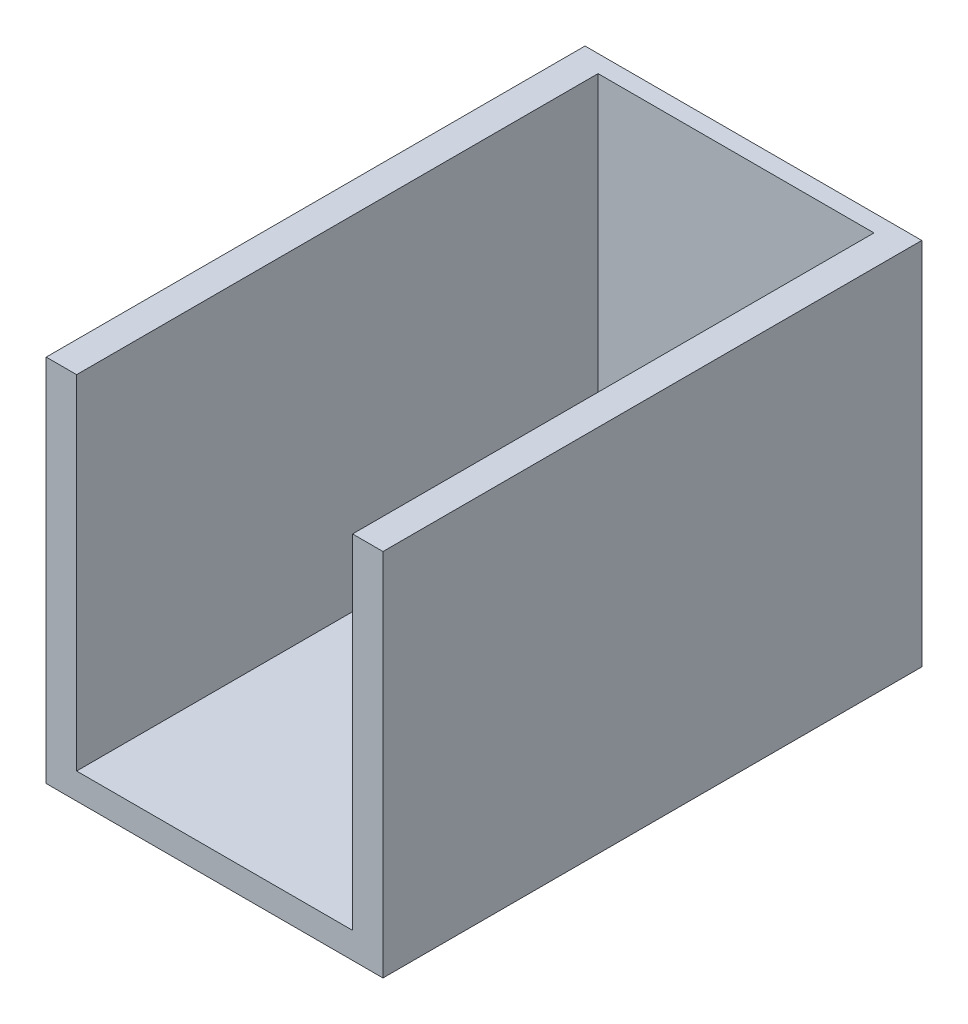
ISO-10303-21;
HEADER;
FILE_DESCRIPTION(('STEP AP214'),'2;1');
FILE_NAME('part.step','',(''),(''),'','','');
FILE_SCHEMA(('AUTOMOTIVE_DESIGN { 1 0 10303 214 1 1 1 1 }'));
ENDSEC;
DATA;
#1=APPLICATION_CONTEXT('core data for automotive mechanical design processes');
#2=APPLICATION_PROTOCOL_DEFINITION('international standard','automotive_design',2000,#1);
#3=PRODUCT_CONTEXT('',#1,'mechanical');
#4=PRODUCT('Part','Part','',(#3));
#5=PRODUCT_RELATED_PRODUCT_CATEGORY('part','',(#4));
#6=PRODUCT_DEFINITION_FORMATION('','',#4);
#7=PRODUCT_DEFINITION_CONTEXT('part definition',#1,'design');
#8=PRODUCT_DEFINITION('design','',#6,#7);
#9=PRODUCT_DEFINITION_SHAPE('','',#8);
#10=(LENGTH_UNIT() NAMED_UNIT(*) SI_UNIT(.MILLI.,.METRE.));
#11=(NAMED_UNIT(*) PLANE_ANGLE_UNIT() SI_UNIT($,.RADIAN.));
#12=(NAMED_UNIT(*) SI_UNIT($,.STERADIAN.) SOLID_ANGLE_UNIT());
#13=UNCERTAINTY_MEASURE_WITH_UNIT(LENGTH_MEASURE(1.E-05),#10,'distance_accuracy_value','');
#14=(GEOMETRIC_REPRESENTATION_CONTEXT(3) GLOBAL_UNCERTAINTY_ASSIGNED_CONTEXT((#13)) GLOBAL_UNIT_ASSIGNED_CONTEXT((#10,
#11,#12)) REPRESENTATION_CONTEXT('',''));
#15=CARTESIAN_POINT('',(0.,0.,0.));
#16=DIRECTION('',(0.,0.,1.));
#17=DIRECTION('',(1.,0.,0.));
#18=AXIS2_PLACEMENT_3D('',#15,#16,#17);
#19=CARTESIAN_POINT('',(31.75,79.,60.));
#20=DIRECTION('',(1.,0.,0.));
#21=DIRECTION('',(0.,1.,0.));
#22=AXIS2_PLACEMENT_3D('',#19,#20,#21);
#23=PLANE('',#22);
#24=DIRECTION('',(0.,-1.,0.));
#25=VECTOR('',#24,1.);
#26=CARTESIAN_POINT('',(31.75,79.,-60.));
#27=LINE('',#26,#25);
#28=CARTESIAN_POINT('',(31.75,79.,-60.));
#29=VERTEX_POINT('',#28);
#30=CARTESIAN_POINT('',(31.75,0.,-60.));
#31=VERTEX_POINT('',#30);
#32=EDGE_CURVE('E143',#29,#31,#27,.T.);
#33=ORIENTED_EDGE('',*,*,#32,.T.);
#34=DIRECTION('',(0.,0.,-1.));
#35=VECTOR('',#34,1.);
#36=CARTESIAN_POINT('',(31.75,0.,60.));
#37=LINE('',#36,#35);
#38=CARTESIAN_POINT('',(31.75,0.,60.));
#39=VERTEX_POINT('',#38);
#40=EDGE_CURVE('E56',#39,#31,#37,.T.);
#41=ORIENTED_EDGE('',*,*,#40,.F.);
#42=DIRECTION('',(0.,-1.,0.));
#43=VECTOR('',#42,1.);
#44=CARTESIAN_POINT('',(31.75,79.,60.));
#45=LINE('',#44,#43);
#46=CARTESIAN_POINT('',(31.75,79.,60.));
#47=VERTEX_POINT('',#46);
#48=EDGE_CURVE('E148',#47,#39,#45,.T.);
#49=ORIENTED_EDGE('',*,*,#48,.F.);
#50=DIRECTION('',(0.,0.,-1.));
#51=VECTOR('',#50,1.);
#52=CARTESIAN_POINT('',(31.75,79.,60.));
#53=LINE('',#52,#51);
#54=EDGE_CURVE('E11',#47,#29,#53,.T.);
#55=ORIENTED_EDGE('',*,*,#54,.T.);
#56=EDGE_LOOP('',(#33,#41,#49,#55));
#57=FACE_BOUND('',#56,.T.);
#58=ADVANCED_FACE('F47',(#57),#23,.F.);
#59=CARTESIAN_POINT('',(-31.75,0.,60.));
#60=DIRECTION('',(0.,-1.,0.));
#61=DIRECTION('',(1.,0.,0.));
#62=AXIS2_PLACEMENT_3D('',#59,#60,#61);
#63=PLANE('',#62);
#64=DIRECTION('',(-1.,0.,0.));
#65=VECTOR('',#64,1.);
#66=CARTESIAN_POINT('',(-31.75,0.,-60.));
#67=LINE('',#66,#65);
#68=CARTESIAN_POINT('',(-31.75,0.,-60.));
#69=VERTEX_POINT('',#68);
#70=EDGE_CURVE('E172',#31,#69,#67,.T.);
#71=ORIENTED_EDGE('',*,*,#70,.T.);
#72=DIRECTION('',(0.,0.,-1.));
#73=VECTOR('',#72,1.);
#74=CARTESIAN_POINT('',(-31.75,0.,60.));
#75=LINE('',#74,#73);
#76=CARTESIAN_POINT('',(-31.75,0.,60.));
#77=VERTEX_POINT('',#76);
#78=EDGE_CURVE('E190',#77,#69,#75,.T.);
#79=ORIENTED_EDGE('',*,*,#78,.F.);
#80=DIRECTION('',(-1.,0.,0.));
#81=VECTOR('',#80,1.);
#82=CARTESIAN_POINT('',(-31.75,0.,60.));
#83=LINE('',#82,#81);
#84=EDGE_CURVE('E152',#39,#77,#83,.T.);
#85=ORIENTED_EDGE('',*,*,#84,.F.);
#86=ORIENTED_EDGE('',*,*,#40,.T.);
#87=EDGE_LOOP('',(#71,#79,#85,#86));
#88=FACE_BOUND('',#87,.T.);
#89=ADVANCED_FACE('F198',(#88),#63,.F.);
#90=CARTESIAN_POINT('',(-31.75,0.,60.));
#91=DIRECTION('',(-1.,0.,0.));
#92=DIRECTION('',(0.,-1.,0.));
#93=AXIS2_PLACEMENT_3D('',#90,#91,#92);
#94=PLANE('',#93);
#95=DIRECTION('',(0.,1.,0.));
#96=VECTOR('',#95,1.);
#97=CARTESIAN_POINT('',(-31.75,0.,-60.));
#98=LINE('',#97,#96);
#99=CARTESIAN_POINT('',(-31.75,79.,-60.));
#100=VERTEX_POINT('',#99);
#101=EDGE_CURVE('E149',#69,#100,#98,.T.);
#102=ORIENTED_EDGE('',*,*,#101,.T.);
#103=DIRECTION('',(0.,0.,-1.));
#104=VECTOR('',#103,1.);
#105=CARTESIAN_POINT('',(-31.75,79.,60.));
#106=LINE('',#105,#104);
#107=CARTESIAN_POINT('',(-31.75,79.,60.));
#108=VERTEX_POINT('',#107);
#109=EDGE_CURVE('E186',#108,#100,#106,.T.);
#110=ORIENTED_EDGE('',*,*,#109,.F.);
#111=DIRECTION('',(0.,1.,0.));
#112=VECTOR('',#111,1.);
#113=CARTESIAN_POINT('',(-31.75,0.,60.));
#114=LINE('',#113,#112);
#115=EDGE_CURVE('E155',#77,#108,#114,.T.);
#116=ORIENTED_EDGE('',*,*,#115,.F.);
#117=ORIENTED_EDGE('',*,*,#78,.T.);
#118=EDGE_LOOP('',(#102,#110,#116,#117));
#119=FACE_BOUND('',#118,.T.);
#120=ADVANCED_FACE('F213',(#119),#94,.F.);
#121=CARTESIAN_POINT('',(-31.75,79.,60.));
#122=DIRECTION('',(0.,-1.,0.));
#123=DIRECTION('',(0.,0.,-1.));
#124=AXIS2_PLACEMENT_3D('',#121,#122,#123);
#125=PLANE('',#124);
#126=ORIENTED_EDGE('',*,*,#109,.T.);
#127=DIRECTION('',(1.,0.,0.));
#128=VECTOR('',#127,1.);
#129=CARTESIAN_POINT('',(38.75,79.,-60.));
#130=LINE('',#129,#128);
#131=EDGE_CURVE('E134',#100,#29,#130,.T.);
#132=ORIENTED_EDGE('',*,*,#131,.T.);
#133=ORIENTED_EDGE('',*,*,#54,.F.);
#134=DIRECTION('',(-1.,0.,0.));
#135=VECTOR('',#134,1.);
#136=CARTESIAN_POINT('',(38.75,79.,60.));
#137=LINE('',#136,#135);
#138=CARTESIAN_POINT('',(38.75,79.,60.));
#139=VERTEX_POINT('',#138);
#140=EDGE_CURVE('E145',#139,#47,#137,.T.);
#141=ORIENTED_EDGE('',*,*,#140,.F.);
#142=DIRECTION('',(0.,0.,-1.));
#143=VECTOR('',#142,1.);
#144=CARTESIAN_POINT('',(38.75,79.,60.));
#145=LINE('',#144,#143);
#146=CARTESIAN_POINT('',(38.75,79.,-64.));
#147=VERTEX_POINT('',#146);
#148=EDGE_CURVE('E117',#139,#147,#145,.T.);
#149=ORIENTED_EDGE('',*,*,#148,.T.);
#150=DIRECTION('',(1.,0.,0.));
#151=VECTOR('',#150,1.);
#152=CARTESIAN_POINT('',(38.75,79.,-64.));
#153=LINE('',#152,#151);
#154=CARTESIAN_POINT('',(-38.75,79.,-64.));
#155=VERTEX_POINT('',#154);
#156=EDGE_CURVE('E132',#155,#147,#153,.T.);
#157=ORIENTED_EDGE('',*,*,#156,.F.);
#158=DIRECTION('',(0.,0.,-1.));
#159=VECTOR('',#158,1.);
#160=CARTESIAN_POINT('',(-38.75,79.,60.));
#161=LINE('',#160,#159);
#162=CARTESIAN_POINT('',(-38.75,79.,60.));
#163=VERTEX_POINT('',#162);
#164=EDGE_CURVE('E183',#163,#155,#161,.T.);
#165=ORIENTED_EDGE('',*,*,#164,.F.);
#166=DIRECTION('',(-1.,0.,0.));
#167=VECTOR('',#166,1.);
#168=CARTESIAN_POINT('',(-31.75,79.,60.));
#169=LINE('',#168,#167);
#170=EDGE_CURVE('E158',#108,#163,#169,.T.);
#171=ORIENTED_EDGE('',*,*,#170,.F.);
#172=EDGE_LOOP('',(#126,#132,#133,#141,#149,#157,#165,#171));
#173=FACE_BOUND('',#172,.T.);
#174=ADVANCED_FACE('F206',(#173),#125,.F.);
#175=CARTESIAN_POINT('',(-38.75,79.,60.));
#176=DIRECTION('',(1.,0.,0.));
#177=DIRECTION('',(0.,1.,0.));
#178=AXIS2_PLACEMENT_3D('',#175,#176,#177);
#179=PLANE('',#178);
#180=ORIENTED_EDGE('',*,*,#164,.T.);
#181=DIRECTION('',(0.,1.,0.));
#182=VECTOR('',#181,1.);
#183=CARTESIAN_POINT('',(-38.75,-6.,-64.));
#184=LINE('',#183,#182);
#185=CARTESIAN_POINT('',(-38.75,-6.,-64.));
#186=VERTEX_POINT('',#185);
#187=EDGE_CURVE('E127',#186,#155,#184,.T.);
#188=ORIENTED_EDGE('',*,*,#187,.F.);
#189=DIRECTION('',(0.,0.,-1.));
#190=VECTOR('',#189,1.);
#191=CARTESIAN_POINT('',(-38.75,-5.99999999999999,60.));
#192=LINE('',#191,#190);
#193=CARTESIAN_POINT('',(-38.75,-5.99999999999999,60.));
#194=VERTEX_POINT('',#193);
#195=EDGE_CURVE('E116',#194,#186,#192,.T.);
#196=ORIENTED_EDGE('',*,*,#195,.F.);
#197=DIRECTION('',(0.,-1.,0.));
#198=VECTOR('',#197,1.);
#199=CARTESIAN_POINT('',(-38.75,79.,60.));
#200=LINE('',#199,#198);
#201=EDGE_CURVE('E161',#163,#194,#200,.T.);
#202=ORIENTED_EDGE('',*,*,#201,.F.);
#203=EDGE_LOOP('',(#180,#188,#196,#202));
#204=FACE_BOUND('',#203,.T.);
#205=ADVANCED_FACE('F217',(#204),#179,.F.);
#206=CARTESIAN_POINT('',(-38.75,-5.99999999999999,60.));
#207=DIRECTION('',(0.,1.,0.));
#208=DIRECTION('',(-1.,0.,0.));
#209=AXIS2_PLACEMENT_3D('',#206,#207,#208);
#210=PLANE('',#209);
#211=ORIENTED_EDGE('',*,*,#195,.T.);
#212=DIRECTION('',(-1.,0.,0.));
#213=VECTOR('',#212,1.);
#214=CARTESIAN_POINT('',(38.75,-6.,-64.));
#215=LINE('',#214,#213);
#216=CARTESIAN_POINT('',(38.75,-6.,-64.));
#217=VERTEX_POINT('',#216);
#218=EDGE_CURVE('E120',#217,#186,#215,.T.);
#219=ORIENTED_EDGE('',*,*,#218,.F.);
#220=DIRECTION('',(0.,0.,-1.));
#221=VECTOR('',#220,1.);
#222=CARTESIAN_POINT('',(38.75,-6.,60.));
#223=LINE('',#222,#221);
#224=CARTESIAN_POINT('',(38.75,-6.,60.));
#225=VERTEX_POINT('',#224);
#226=EDGE_CURVE('E108',#225,#217,#223,.T.);
#227=ORIENTED_EDGE('',*,*,#226,.F.);
#228=DIRECTION('',(1.,0.,0.));
#229=VECTOR('',#228,1.);
#230=CARTESIAN_POINT('',(-38.75,-5.99999999999999,60.));
#231=LINE('',#230,#229);
#232=EDGE_CURVE('E164',#194,#225,#231,.T.);
#233=ORIENTED_EDGE('',*,*,#232,.F.);
#234=EDGE_LOOP('',(#211,#219,#227,#233));
#235=FACE_BOUND('',#234,.T.);
#236=ADVANCED_FACE('F121',(#235),#210,.F.);
#237=CARTESIAN_POINT('',(38.75,-6.,60.));
#238=DIRECTION('',(-1.,0.,0.));
#239=DIRECTION('',(0.,0.,1.));
#240=AXIS2_PLACEMENT_3D('',#237,#238,#239);
#241=PLANE('',#240);
#242=ORIENTED_EDGE('',*,*,#226,.T.);
#243=DIRECTION('',(0.,-1.,0.));
#244=VECTOR('',#243,1.);
#245=CARTESIAN_POINT('',(38.75,-6.,-64.));
#246=LINE('',#245,#244);
#247=EDGE_CURVE('E112',#147,#217,#246,.T.);
#248=ORIENTED_EDGE('',*,*,#247,.F.);
#249=ORIENTED_EDGE('',*,*,#148,.F.);
#250=DIRECTION('',(0.,1.,0.));
#251=VECTOR('',#250,1.);
#252=CARTESIAN_POINT('',(38.75,-6.,60.));
#253=LINE('',#252,#251);
#254=EDGE_CURVE('E63',#225,#139,#253,.T.);
#255=ORIENTED_EDGE('',*,*,#254,.F.);
#256=EDGE_LOOP('',(#242,#248,#249,#255));
#257=FACE_BOUND('',#256,.T.);
#258=ADVANCED_FACE('F110',(#257),#241,.F.);
#259=CARTESIAN_POINT('',(0.,0.,60.));
#260=DIRECTION('',(0.,0.,1.));
#261=DIRECTION('',(1.,0.,0.));
#262=AXIS2_PLACEMENT_3D('',#259,#260,#261);
#263=PLANE('',#262);
#264=ORIENTED_EDGE('',*,*,#140,.T.);
#265=ORIENTED_EDGE('',*,*,#48,.T.);
#266=ORIENTED_EDGE('',*,*,#84,.T.);
#267=ORIENTED_EDGE('',*,*,#115,.T.);
#268=ORIENTED_EDGE('',*,*,#170,.T.);
#269=ORIENTED_EDGE('',*,*,#201,.T.);
#270=ORIENTED_EDGE('',*,*,#232,.T.);
#271=ORIENTED_EDGE('',*,*,#254,.T.);
#272=EDGE_LOOP('',(#264,#265,#266,#267,#268,#269,#270,#271));
#273=FACE_BOUND('',#272,.T.);
#274=ADVANCED_FACE('F214',(#273),#263,.T.);
#275=CARTESIAN_POINT('',(0.,0.,-60.));
#276=DIRECTION('',(0.,0.,1.));
#277=DIRECTION('',(1.,0.,0.));
#278=AXIS2_PLACEMENT_3D('',#275,#276,#277);
#279=PLANE('',#278);
#280=ORIENTED_EDGE('',*,*,#101,.F.);
#281=ORIENTED_EDGE('',*,*,#70,.F.);
#282=ORIENTED_EDGE('',*,*,#32,.F.);
#283=ORIENTED_EDGE('',*,*,#131,.F.);
#284=EDGE_LOOP('',(#280,#281,#282,#283));
#285=FACE_BOUND('',#284,.T.);
#286=ADVANCED_FACE('F204',(#285),#279,.T.);
#287=CARTESIAN_POINT('',(0.,0.,-64.));
#288=DIRECTION('',(0.,0.,1.));
#289=DIRECTION('',(1.,0.,0.));
#290=AXIS2_PLACEMENT_3D('',#287,#288,#289);
#291=PLANE('',#290);
#292=ORIENTED_EDGE('',*,*,#247,.T.);
#293=ORIENTED_EDGE('',*,*,#218,.T.);
#294=ORIENTED_EDGE('',*,*,#187,.T.);
#295=ORIENTED_EDGE('',*,*,#156,.T.);
#296=EDGE_LOOP('',(#292,#293,#294,#295));
#297=FACE_BOUND('',#296,.T.);
#298=ADVANCED_FACE('F130',(#297),#291,.F.);
#299=CLOSED_SHELL('',(#58,#89,#120,#174,#205,#236,#258,#274,#286,#298));
#300=MANIFOLD_SOLID_BREP('B2',#299);
#301=ADVANCED_BREP_SHAPE_REPRESENTATION('',(#18,#300),#14);
#302=SHAPE_DEFINITION_REPRESENTATION(#9,#301);
ENDSEC;
END-ISO-10303-21;
